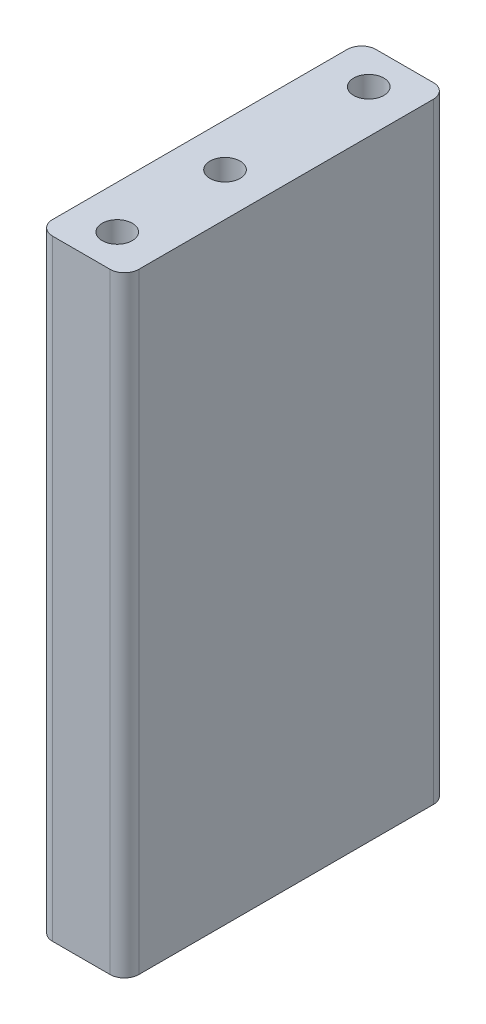
ISO-10303-21;
HEADER;
FILE_DESCRIPTION(('STEP AP214'),'2;1');
FILE_NAME('part.step','',(''),(''),'','','');
FILE_SCHEMA(('AUTOMOTIVE_DESIGN { 1 0 10303 214 1 1 1 1 }'));
ENDSEC;
DATA;
#1=APPLICATION_CONTEXT('core data for automotive mechanical design processes');
#2=APPLICATION_PROTOCOL_DEFINITION('international standard','automotive_design',2000,#1);
#3=PRODUCT_CONTEXT('',#1,'mechanical');
#4=PRODUCT('Part','Part','',(#3));
#5=PRODUCT_RELATED_PRODUCT_CATEGORY('part','',(#4));
#6=PRODUCT_DEFINITION_FORMATION('','',#4);
#7=PRODUCT_DEFINITION_CONTEXT('part definition',#1,'design');
#8=PRODUCT_DEFINITION('design','',#6,#7);
#9=PRODUCT_DEFINITION_SHAPE('','',#8);
#10=(LENGTH_UNIT() NAMED_UNIT(*) SI_UNIT(.MILLI.,.METRE.));
#11=(NAMED_UNIT(*) PLANE_ANGLE_UNIT() SI_UNIT($,.RADIAN.));
#12=(NAMED_UNIT(*) SI_UNIT($,.STERADIAN.) SOLID_ANGLE_UNIT());
#13=UNCERTAINTY_MEASURE_WITH_UNIT(LENGTH_MEASURE(1.E-05),#10,'distance_accuracy_value','');
#14=(GEOMETRIC_REPRESENTATION_CONTEXT(3) GLOBAL_UNCERTAINTY_ASSIGNED_CONTEXT((#13)) GLOBAL_UNIT_ASSIGNED_CONTEXT((#10,
#11,#12)) REPRESENTATION_CONTEXT('',''));
#15=CARTESIAN_POINT('',(0.,0.,0.));
#16=DIRECTION('',(0.,0.,1.));
#17=DIRECTION('',(1.,0.,0.));
#18=AXIS2_PLACEMENT_3D('',#15,#16,#17);
#19=CARTESIAN_POINT('',(6.,-85.,0.));
#20=DIRECTION('',(-1.,0.,0.));
#21=DIRECTION('',(0.,0.,1.));
#22=AXIS2_PLACEMENT_3D('',#19,#20,#21);
#23=PLANE('',#22);
#24=DIRECTION('',(0.,0.,1.));
#25=VECTOR('',#24,1.);
#26=CARTESIAN_POINT('',(6.,-85.,0.));
#27=LINE('',#26,#25);
#28=CARTESIAN_POINT('',(6.,-85.,-13.));
#29=VERTEX_POINT('',#28);
#30=CARTESIAN_POINT('',(6.,-85.,28.));
#31=VERTEX_POINT('',#30);
#32=EDGE_CURVE('E184',#29,#31,#27,.T.);
#33=ORIENTED_EDGE('',*,*,#32,.F.);
#34=DIRECTION('',(0.,1.,0.));
#35=VECTOR('',#34,1.);
#36=CARTESIAN_POINT('',(6.,0.,-13.));
#37=LINE('',#36,#35);
#38=CARTESIAN_POINT('',(6.,0.,-13.));
#39=VERTEX_POINT('',#38);
#40=EDGE_CURVE('E174',#29,#39,#37,.T.);
#41=ORIENTED_EDGE('',*,*,#40,.T.);
#42=DIRECTION('',(0.,0.,1.));
#43=VECTOR('',#42,1.);
#44=CARTESIAN_POINT('',(6.,0.,0.));
#45=LINE('',#44,#43);
#46=CARTESIAN_POINT('',(6.,0.,28.));
#47=VERTEX_POINT('',#46);
#48=EDGE_CURVE('E112',#39,#47,#45,.T.);
#49=ORIENTED_EDGE('',*,*,#48,.T.);
#50=DIRECTION('',(0.,1.,0.));
#51=VECTOR('',#50,1.);
#52=CARTESIAN_POINT('',(6.,-85.,28.));
#53=LINE('',#52,#51);
#54=EDGE_CURVE('E171',#47,#31,#53,.F.);
#55=ORIENTED_EDGE('',*,*,#54,.T.);
#56=EDGE_LOOP('',(#33,#41,#49,#55));
#57=FACE_BOUND('',#56,.T.);
#58=ADVANCED_FACE('F41',(#57),#23,.F.);
#59=CARTESIAN_POINT('',(0.,-85.,30.));
#60=DIRECTION('',(0.,0.,1.));
#61=DIRECTION('',(1.,0.,0.));
#62=AXIS2_PLACEMENT_3D('',#59,#60,#61);
#63=PLANE('',#62);
#64=DIRECTION('',(1.,0.,0.));
#65=VECTOR('',#64,1.);
#66=CARTESIAN_POINT('',(0.,0.,30.));
#67=LINE('',#66,#65);
#68=CARTESIAN_POINT('',(-4.,0.,30.));
#69=VERTEX_POINT('',#68);
#70=CARTESIAN_POINT('',(4.,0.,30.));
#71=VERTEX_POINT('',#70);
#72=EDGE_CURVE('E145',#69,#71,#67,.T.);
#73=ORIENTED_EDGE('',*,*,#72,.F.);
#74=DIRECTION('',(0.,1.,0.));
#75=VECTOR('',#74,1.);
#76=CARTESIAN_POINT('',(-4.,-85.,30.));
#77=LINE('',#76,#75);
#78=CARTESIAN_POINT('',(-4.,-85.,30.));
#79=VERTEX_POINT('',#78);
#80=EDGE_CURVE('E11',#69,#79,#77,.F.);
#81=ORIENTED_EDGE('',*,*,#80,.T.);
#82=DIRECTION('',(1.,0.,0.));
#83=VECTOR('',#82,1.);
#84=CARTESIAN_POINT('',(0.,-85.,30.));
#85=LINE('',#84,#83);
#86=CARTESIAN_POINT('',(4.,-85.,30.));
#87=VERTEX_POINT('',#86);
#88=EDGE_CURVE('E136',#79,#87,#85,.T.);
#89=ORIENTED_EDGE('',*,*,#88,.T.);
#90=DIRECTION('',(0.,1.,0.));
#91=VECTOR('',#90,1.);
#92=CARTESIAN_POINT('',(4.,0.,30.));
#93=LINE('',#92,#91);
#94=EDGE_CURVE('E50',#87,#71,#93,.T.);
#95=ORIENTED_EDGE('',*,*,#94,.T.);
#96=EDGE_LOOP('',(#73,#81,#89,#95));
#97=FACE_BOUND('',#96,.T.);
#98=ADVANCED_FACE('F180',(#97),#63,.T.);
#99=CARTESIAN_POINT('',(-6.,-85.,0.));
#100=DIRECTION('',(-1.,0.,0.));
#101=DIRECTION('',(0.,0.,1.));
#102=AXIS2_PLACEMENT_3D('',#99,#100,#101);
#103=PLANE('',#102);
#104=DIRECTION('',(0.,0.,1.));
#105=VECTOR('',#104,1.);
#106=CARTESIAN_POINT('',(-6.,0.,0.));
#107=LINE('',#106,#105);
#108=CARTESIAN_POINT('',(-6.,0.,-13.));
#109=VERTEX_POINT('',#108);
#110=CARTESIAN_POINT('',(-6.,0.,28.));
#111=VERTEX_POINT('',#110);
#112=EDGE_CURVE('E130',#109,#111,#107,.T.);
#113=ORIENTED_EDGE('',*,*,#112,.F.);
#114=DIRECTION('',(0.,1.,0.));
#115=VECTOR('',#114,1.);
#116=CARTESIAN_POINT('',(-6.,-85.,-13.));
#117=LINE('',#116,#115);
#118=CARTESIAN_POINT('',(-6.,-85.,-13.));
#119=VERTEX_POINT('',#118);
#120=EDGE_CURVE('E158',#109,#119,#117,.F.);
#121=ORIENTED_EDGE('',*,*,#120,.T.);
#122=DIRECTION('',(0.,0.,1.));
#123=VECTOR('',#122,1.);
#124=CARTESIAN_POINT('',(-6.,-85.,0.));
#125=LINE('',#124,#123);
#126=CARTESIAN_POINT('',(-6.,-85.,28.));
#127=VERTEX_POINT('',#126);
#128=EDGE_CURVE('E142',#119,#127,#125,.T.);
#129=ORIENTED_EDGE('',*,*,#128,.T.);
#130=DIRECTION('',(0.,1.,0.));
#131=VECTOR('',#130,1.);
#132=CARTESIAN_POINT('',(-6.,-85.,28.));
#133=LINE('',#132,#131);
#134=EDGE_CURVE('E154',#127,#111,#133,.T.);
#135=ORIENTED_EDGE('',*,*,#134,.T.);
#136=EDGE_LOOP('',(#113,#121,#129,#135));
#137=FACE_BOUND('',#136,.T.);
#138=ADVANCED_FACE('F251',(#137),#103,.T.);
#139=CARTESIAN_POINT('',(0.,-85.,-15.));
#140=DIRECTION('',(0.,0.,-1.));
#141=DIRECTION('',(-1.,0.,0.));
#142=AXIS2_PLACEMENT_3D('',#139,#140,#141);
#143=PLANE('',#142);
#144=DIRECTION('',(-1.,0.,0.));
#145=VECTOR('',#144,1.);
#146=CARTESIAN_POINT('',(0.,-85.,-15.));
#147=LINE('',#146,#145);
#148=CARTESIAN_POINT('',(4.,-85.,-15.));
#149=VERTEX_POINT('',#148);
#150=CARTESIAN_POINT('',(-4.,-85.,-15.));
#151=VERTEX_POINT('',#150);
#152=EDGE_CURVE('E187',#149,#151,#147,.T.);
#153=ORIENTED_EDGE('',*,*,#152,.T.);
#154=DIRECTION('',(0.,1.,0.));
#155=VECTOR('',#154,1.);
#156=CARTESIAN_POINT('',(-4.,-85.,-15.));
#157=LINE('',#156,#155);
#158=CARTESIAN_POINT('',(-4.,0.,-15.));
#159=VERTEX_POINT('',#158);
#160=EDGE_CURVE('E128',#151,#159,#157,.T.);
#161=ORIENTED_EDGE('',*,*,#160,.T.);
#162=DIRECTION('',(-1.,0.,0.));
#163=VECTOR('',#162,1.);
#164=CARTESIAN_POINT('',(0.,0.,-15.));
#165=LINE('',#164,#163);
#166=CARTESIAN_POINT('',(4.,0.,-15.));
#167=VERTEX_POINT('',#166);
#168=EDGE_CURVE('E110',#167,#159,#165,.T.);
#169=ORIENTED_EDGE('',*,*,#168,.F.);
#170=DIRECTION('',(0.,1.,0.));
#171=VECTOR('',#170,1.);
#172=CARTESIAN_POINT('',(4.,-85.,-15.));
#173=LINE('',#172,#171);
#174=EDGE_CURVE('E125',#167,#149,#173,.F.);
#175=ORIENTED_EDGE('',*,*,#174,.T.);
#176=EDGE_LOOP('',(#153,#161,#169,#175));
#177=FACE_BOUND('',#176,.T.);
#178=ADVANCED_FACE('F124',(#177),#143,.T.);
#179=CARTESIAN_POINT('',(0.,-85.,0.));
#180=DIRECTION('',(0.,1.,0.));
#181=DIRECTION('',(0.,0.,1.));
#182=AXIS2_PLACEMENT_3D('',#179,#180,#181);
#183=PLANE('',#182);
#184=CARTESIAN_POINT('',(0.,-85.,-10.));
#185=DIRECTION('',(0.,1.,0.));
#186=DIRECTION('',(0.,0.,1.));
#187=AXIS2_PLACEMENT_3D('',#184,#185,#186);
#188=CIRCLE('',#187,2.09999999999999);
#189=CARTESIAN_POINT('',(0.,-85.,-7.90000000000002));
#190=VERTEX_POINT('',#189);
#191=EDGE_CURVE('E214',#190,#190,#188,.T.);
#192=ORIENTED_EDGE('',*,*,#191,.T.);
#193=EDGE_LOOP('',(#192));
#194=FACE_BOUND('',#193,.T.);
#195=CARTESIAN_POINT('',(0.,-85.,10.));
#196=DIRECTION('',(0.,1.,0.));
#197=DIRECTION('',(0.,0.,1.));
#198=AXIS2_PLACEMENT_3D('',#195,#196,#197);
#199=CIRCLE('',#198,2.09999999999999);
#200=CARTESIAN_POINT('',(0.,-85.,12.1));
#201=VERTEX_POINT('',#200);
#202=EDGE_CURVE('E206',#201,#201,#199,.T.);
#203=ORIENTED_EDGE('',*,*,#202,.T.);
#204=EDGE_LOOP('',(#203));
#205=FACE_BOUND('',#204,.T.);
#206=CARTESIAN_POINT('',(0.,-85.,25.));
#207=DIRECTION('',(0.,1.,0.));
#208=DIRECTION('',(0.,0.,1.));
#209=AXIS2_PLACEMENT_3D('',#206,#207,#208);
#210=CIRCLE('',#209,2.09999999999999);
#211=CARTESIAN_POINT('',(0.,-85.,27.1));
#212=VERTEX_POINT('',#211);
#213=EDGE_CURVE('E192',#212,#212,#210,.T.);
#214=ORIENTED_EDGE('',*,*,#213,.T.);
#215=EDGE_LOOP('',(#214));
#216=FACE_BOUND('',#215,.T.);
#217=ORIENTED_EDGE('',*,*,#128,.F.);
#218=CARTESIAN_POINT('',(-4.,-85.,-13.));
#219=DIRECTION('',(0.,1.,0.));
#220=DIRECTION('',(0.,0.,1.));
#221=AXIS2_PLACEMENT_3D('',#218,#219,#220);
#222=CIRCLE('',#221,2.);
#223=EDGE_CURVE('E168',#119,#151,#222,.F.);
#224=ORIENTED_EDGE('',*,*,#223,.T.);
#225=ORIENTED_EDGE('',*,*,#152,.F.);
#226=CARTESIAN_POINT('',(4.,-85.,-13.));
#227=DIRECTION('',(0.,1.,0.));
#228=DIRECTION('',(0.,0.,1.));
#229=AXIS2_PLACEMENT_3D('',#226,#227,#228);
#230=CIRCLE('',#229,2.);
#231=EDGE_CURVE('E134',#149,#29,#230,.F.);
#232=ORIENTED_EDGE('',*,*,#231,.T.);
#233=ORIENTED_EDGE('',*,*,#32,.T.);
#234=CARTESIAN_POINT('',(4.,-85.,28.));
#235=DIRECTION('',(0.,1.,0.));
#236=DIRECTION('',(0.,0.,1.));
#237=AXIS2_PLACEMENT_3D('',#234,#235,#236);
#238=CIRCLE('',#237,2.);
#239=EDGE_CURVE('E57',#31,#87,#238,.F.);
#240=ORIENTED_EDGE('',*,*,#239,.T.);
#241=ORIENTED_EDGE('',*,*,#88,.F.);
#242=CARTESIAN_POINT('',(-4.,-85.,28.));
#243=DIRECTION('',(0.,1.,0.));
#244=DIRECTION('',(0.,0.,1.));
#245=AXIS2_PLACEMENT_3D('',#242,#243,#244);
#246=CIRCLE('',#245,2.);
#247=EDGE_CURVE('E163',#79,#127,#246,.F.);
#248=ORIENTED_EDGE('',*,*,#247,.T.);
#249=EDGE_LOOP('',(#217,#224,#225,#232,#233,#240,#241,#248));
#250=FACE_BOUND('',#249,.T.);
#251=ADVANCED_FACE('F228',(#194,#205,#216,#250),#183,.F.);
#252=CARTESIAN_POINT('',(0.,0.,0.));
#253=DIRECTION('',(0.,1.,0.));
#254=DIRECTION('',(0.,0.,1.));
#255=AXIS2_PLACEMENT_3D('',#252,#253,#254);
#256=PLANE('',#255);
#257=CARTESIAN_POINT('',(0.,0.,-10.));
#258=DIRECTION('',(0.,1.,0.));
#259=DIRECTION('',(0.,0.,1.));
#260=AXIS2_PLACEMENT_3D('',#257,#258,#259);
#261=CIRCLE('',#260,2.09999999999999);
#262=CARTESIAN_POINT('',(0.,0.,-7.90000000000001));
#263=VERTEX_POINT('',#262);
#264=EDGE_CURVE('E218',#263,#263,#261,.T.);
#265=ORIENTED_EDGE('',*,*,#264,.F.);
#266=EDGE_LOOP('',(#265));
#267=FACE_BOUND('',#266,.T.);
#268=CARTESIAN_POINT('',(0.,0.,10.));
#269=DIRECTION('',(0.,1.,0.));
#270=DIRECTION('',(0.,0.,1.));
#271=AXIS2_PLACEMENT_3D('',#268,#269,#270);
#272=CIRCLE('',#271,2.09999999999999);
#273=CARTESIAN_POINT('',(0.,0.,12.1));
#274=VERTEX_POINT('',#273);
#275=EDGE_CURVE('E210',#274,#274,#272,.T.);
#276=ORIENTED_EDGE('',*,*,#275,.F.);
#277=EDGE_LOOP('',(#276));
#278=FACE_BOUND('',#277,.T.);
#279=CARTESIAN_POINT('',(0.,0.,25.));
#280=DIRECTION('',(0.,1.,0.));
#281=DIRECTION('',(0.,0.,1.));
#282=AXIS2_PLACEMENT_3D('',#279,#280,#281);
#283=CIRCLE('',#282,2.09999999999999);
#284=CARTESIAN_POINT('',(0.,0.,27.1));
#285=VERTEX_POINT('',#284);
#286=EDGE_CURVE('E202',#285,#285,#283,.T.);
#287=ORIENTED_EDGE('',*,*,#286,.F.);
#288=EDGE_LOOP('',(#287));
#289=FACE_BOUND('',#288,.T.);
#290=ORIENTED_EDGE('',*,*,#168,.T.);
#291=CARTESIAN_POINT('',(-4.,0.,-13.));
#292=DIRECTION('',(0.,1.,0.));
#293=DIRECTION('',(0.,0.,1.));
#294=AXIS2_PLACEMENT_3D('',#291,#292,#293);
#295=CIRCLE('',#294,2.);
#296=EDGE_CURVE('E118',#159,#109,#295,.T.);
#297=ORIENTED_EDGE('',*,*,#296,.T.);
#298=ORIENTED_EDGE('',*,*,#112,.T.);
#299=CARTESIAN_POINT('',(-4.,0.,28.));
#300=DIRECTION('',(0.,1.,0.));
#301=DIRECTION('',(0.,0.,1.));
#302=AXIS2_PLACEMENT_3D('',#299,#300,#301);
#303=CIRCLE('',#302,2.);
#304=EDGE_CURVE('E119',#111,#69,#303,.T.);
#305=ORIENTED_EDGE('',*,*,#304,.T.);
#306=ORIENTED_EDGE('',*,*,#72,.T.);
#307=CARTESIAN_POINT('',(4.,0.,28.));
#308=DIRECTION('',(0.,1.,0.));
#309=DIRECTION('',(0.,0.,1.));
#310=AXIS2_PLACEMENT_3D('',#307,#308,#309);
#311=CIRCLE('',#310,2.);
#312=EDGE_CURVE('E140',#71,#47,#311,.T.);
#313=ORIENTED_EDGE('',*,*,#312,.T.);
#314=ORIENTED_EDGE('',*,*,#48,.F.);
#315=CARTESIAN_POINT('',(4.,0.,-13.));
#316=DIRECTION('',(0.,1.,0.));
#317=DIRECTION('',(0.,0.,1.));
#318=AXIS2_PLACEMENT_3D('',#315,#316,#317);
#319=CIRCLE('',#318,2.);
#320=EDGE_CURVE('E107',#39,#167,#319,.T.);
#321=ORIENTED_EDGE('',*,*,#320,.T.);
#322=EDGE_LOOP('',(#290,#297,#298,#305,#306,#313,#314,#321));
#323=FACE_BOUND('',#322,.T.);
#324=ADVANCED_FACE('F109',(#267,#278,#289,#323),#256,.T.);
#325=CARTESIAN_POINT('',(0.,0.,25.));
#326=DIRECTION('',(0.,1.,0.));
#327=DIRECTION('',(0.,0.,1.));
#328=AXIS2_PLACEMENT_3D('',#325,#326,#327);
#329=CYLINDRICAL_SURFACE('',#328,2.09999999999999);
#330=ORIENTED_EDGE('',*,*,#213,.F.);
#331=EDGE_LOOP('',(#330));
#332=FACE_BOUND('',#331,.T.);
#333=ORIENTED_EDGE('',*,*,#286,.T.);
#334=EDGE_LOOP('',(#333));
#335=FACE_BOUND('',#334,.T.);
#336=ADVANCED_FACE('F227',(#332,#335),#329,.F.);
#337=CARTESIAN_POINT('',(0.,0.,10.));
#338=DIRECTION('',(0.,1.,0.));
#339=DIRECTION('',(0.,0.,1.));
#340=AXIS2_PLACEMENT_3D('',#337,#338,#339);
#341=CYLINDRICAL_SURFACE('',#340,2.09999999999999);
#342=ORIENTED_EDGE('',*,*,#202,.F.);
#343=EDGE_LOOP('',(#342));
#344=FACE_BOUND('',#343,.T.);
#345=ORIENTED_EDGE('',*,*,#275,.T.);
#346=EDGE_LOOP('',(#345));
#347=FACE_BOUND('',#346,.T.);
#348=ADVANCED_FACE('F235',(#344,#347),#341,.F.);
#349=CARTESIAN_POINT('',(0.,0.,-10.));
#350=DIRECTION('',(0.,1.,0.));
#351=DIRECTION('',(0.,0.,1.));
#352=AXIS2_PLACEMENT_3D('',#349,#350,#351);
#353=CYLINDRICAL_SURFACE('',#352,2.09999999999999);
#354=ORIENTED_EDGE('',*,*,#191,.F.);
#355=EDGE_LOOP('',(#354));
#356=FACE_BOUND('',#355,.T.);
#357=ORIENTED_EDGE('',*,*,#264,.T.);
#358=EDGE_LOOP('',(#357));
#359=FACE_BOUND('',#358,.T.);
#360=ADVANCED_FACE('F223',(#356,#359),#353,.F.);
#361=CARTESIAN_POINT('',(-4.,-85.,-13.));
#362=DIRECTION('',(0.,1.,0.));
#363=DIRECTION('',(0.,0.,1.));
#364=AXIS2_PLACEMENT_3D('',#361,#362,#363);
#365=CYLINDRICAL_SURFACE('',#364,2.);
#366=ORIENTED_EDGE('',*,*,#223,.F.);
#367=ORIENTED_EDGE('',*,*,#120,.F.);
#368=ORIENTED_EDGE('',*,*,#296,.F.);
#369=ORIENTED_EDGE('',*,*,#160,.F.);
#370=EDGE_LOOP('',(#366,#367,#368,#369));
#371=FACE_BOUND('',#370,.T.);
#372=ADVANCED_FACE('F257',(#371),#365,.T.);
#373=CARTESIAN_POINT('',(4.,-85.,-13.));
#374=DIRECTION('',(0.,-1.,0.));
#375=DIRECTION('',(0.,0.,-1.));
#376=AXIS2_PLACEMENT_3D('',#373,#374,#375);
#377=CYLINDRICAL_SURFACE('',#376,2.);
#378=ORIENTED_EDGE('',*,*,#231,.F.);
#379=ORIENTED_EDGE('',*,*,#174,.F.);
#380=ORIENTED_EDGE('',*,*,#320,.F.);
#381=ORIENTED_EDGE('',*,*,#40,.F.);
#382=EDGE_LOOP('',(#378,#379,#380,#381));
#383=FACE_BOUND('',#382,.T.);
#384=ADVANCED_FACE('F133',(#383),#377,.T.);
#385=CARTESIAN_POINT('',(-4.,-85.,28.));
#386=DIRECTION('',(0.,1.,0.));
#387=DIRECTION('',(0.,0.,1.));
#388=AXIS2_PLACEMENT_3D('',#385,#386,#387);
#389=CYLINDRICAL_SURFACE('',#388,2.);
#390=ORIENTED_EDGE('',*,*,#247,.F.);
#391=ORIENTED_EDGE('',*,*,#80,.F.);
#392=ORIENTED_EDGE('',*,*,#304,.F.);
#393=ORIENTED_EDGE('',*,*,#134,.F.);
#394=EDGE_LOOP('',(#390,#391,#392,#393));
#395=FACE_BOUND('',#394,.T.);
#396=ADVANCED_FACE('F262',(#395),#389,.T.);
#397=CARTESIAN_POINT('',(4.,-85.,28.));
#398=DIRECTION('',(0.,-1.,0.));
#399=DIRECTION('',(0.,0.,-1.));
#400=AXIS2_PLACEMENT_3D('',#397,#398,#399);
#401=CYLINDRICAL_SURFACE('',#400,2.);
#402=ORIENTED_EDGE('',*,*,#239,.F.);
#403=ORIENTED_EDGE('',*,*,#54,.F.);
#404=ORIENTED_EDGE('',*,*,#312,.F.);
#405=ORIENTED_EDGE('',*,*,#94,.F.);
#406=EDGE_LOOP('',(#402,#403,#404,#405));
#407=FACE_BOUND('',#406,.T.);
#408=ADVANCED_FACE('F43',(#407),#401,.T.);
#409=CLOSED_SHELL('',(#58,#98,#138,#178,#251,#324,#336,#348,#360,#372,#384,#396,#408));
#410=MANIFOLD_SOLID_BREP('B2',#409);
#411=ADVANCED_BREP_SHAPE_REPRESENTATION('',(#18,#410),#14);
#412=SHAPE_DEFINITION_REPRESENTATION(#9,#411);
ENDSEC;
END-ISO-10303-21;
